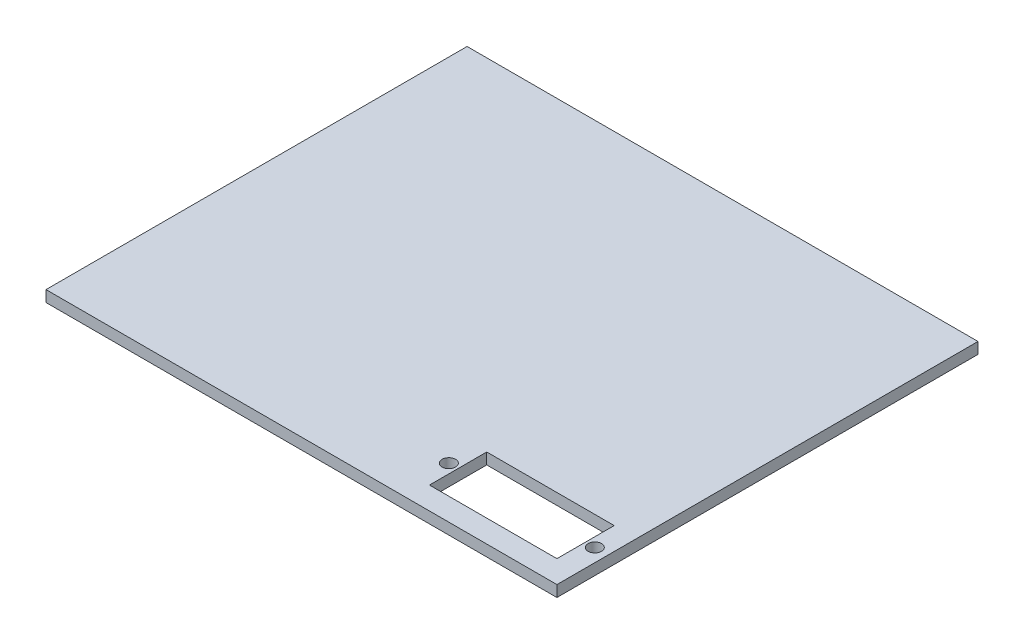
ISO-10303-21;
HEADER;
FILE_DESCRIPTION(('STEP AP214'),'2;1');
FILE_NAME('part.step','',(''),(''),'','','');
FILE_SCHEMA(('AUTOMOTIVE_DESIGN { 1 0 10303 214 1 1 1 1 }'));
ENDSEC;
DATA;
#1=APPLICATION_CONTEXT('core data for automotive mechanical design processes');
#2=APPLICATION_PROTOCOL_DEFINITION('international standard','automotive_design',2000,#1);
#3=PRODUCT_CONTEXT('',#1,'mechanical');
#4=PRODUCT('Part','Part','',(#3));
#5=PRODUCT_RELATED_PRODUCT_CATEGORY('part','',(#4));
#6=PRODUCT_DEFINITION_FORMATION('','',#4);
#7=PRODUCT_DEFINITION_CONTEXT('part definition',#1,'design');
#8=PRODUCT_DEFINITION('design','',#6,#7);
#9=PRODUCT_DEFINITION_SHAPE('','',#8);
#10=(LENGTH_UNIT() NAMED_UNIT(*) SI_UNIT(.MILLI.,.METRE.));
#11=(NAMED_UNIT(*) PLANE_ANGLE_UNIT() SI_UNIT($,.RADIAN.));
#12=(NAMED_UNIT(*) SI_UNIT($,.STERADIAN.) SOLID_ANGLE_UNIT());
#13=UNCERTAINTY_MEASURE_WITH_UNIT(LENGTH_MEASURE(1.E-05),#10,'distance_accuracy_value','');
#14=(GEOMETRIC_REPRESENTATION_CONTEXT(3) GLOBAL_UNCERTAINTY_ASSIGNED_CONTEXT((#13)) GLOBAL_UNIT_ASSIGNED_CONTEXT((#10,
#11,#12)) REPRESENTATION_CONTEXT('',''));
#15=CARTESIAN_POINT('',(0.,0.,0.));
#16=DIRECTION('',(0.,0.,1.));
#17=DIRECTION('',(1.,0.,0.));
#18=AXIS2_PLACEMENT_3D('',#15,#16,#17);
#19=CARTESIAN_POINT('',(45.5,2.,-37.5));
#20=DIRECTION('',(-1.,0.,0.));
#21=DIRECTION('',(0.,0.,1.));
#22=AXIS2_PLACEMENT_3D('',#19,#20,#21);
#23=PLANE('',#22);
#24=DIRECTION('',(0.,0.,-1.));
#25=VECTOR('',#24,1.);
#26=CARTESIAN_POINT('',(45.5,0.,-37.5));
#27=LINE('',#26,#25);
#28=CARTESIAN_POINT('',(45.5,0.,37.5));
#29=VERTEX_POINT('',#28);
#30=CARTESIAN_POINT('',(45.5,0.,-37.5));
#31=VERTEX_POINT('',#30);
#32=EDGE_CURVE('E140',#29,#31,#27,.T.);
#33=ORIENTED_EDGE('',*,*,#32,.T.);
#34=DIRECTION('',(0.,-1.,0.));
#35=VECTOR('',#34,1.);
#36=CARTESIAN_POINT('',(45.5,2.,-37.5));
#37=LINE('',#36,#35);
#38=CARTESIAN_POINT('',(45.5,2.,-37.5));
#39=VERTEX_POINT('',#38);
#40=EDGE_CURVE('E11',#39,#31,#37,.T.);
#41=ORIENTED_EDGE('',*,*,#40,.F.);
#42=DIRECTION('',(0.,0.,-1.));
#43=VECTOR('',#42,1.);
#44=CARTESIAN_POINT('',(45.5,2.,-37.5));
#45=LINE('',#44,#43);
#46=CARTESIAN_POINT('',(45.5,2.,37.5));
#47=VERTEX_POINT('',#46);
#48=EDGE_CURVE('E144',#47,#39,#45,.T.);
#49=ORIENTED_EDGE('',*,*,#48,.F.);
#50=DIRECTION('',(0.,-1.,0.));
#51=VECTOR('',#50,1.);
#52=CARTESIAN_POINT('',(45.5,2.,37.5));
#53=LINE('',#52,#51);
#54=EDGE_CURVE('E154',#47,#29,#53,.T.);
#55=ORIENTED_EDGE('',*,*,#54,.T.);
#56=EDGE_LOOP('',(#33,#41,#49,#55));
#57=FACE_BOUND('',#56,.T.);
#58=ADVANCED_FACE('F39',(#57),#23,.F.);
#59=CARTESIAN_POINT('',(-45.5,2.,-37.5));
#60=DIRECTION('',(0.,0.,1.));
#61=DIRECTION('',(1.,0.,0.));
#62=AXIS2_PLACEMENT_3D('',#59,#60,#61);
#63=PLANE('',#62);
#64=DIRECTION('',(-1.,0.,0.));
#65=VECTOR('',#64,1.);
#66=CARTESIAN_POINT('',(-45.5,0.,-37.5));
#67=LINE('',#66,#65);
#68=CARTESIAN_POINT('',(-45.5,0.,-37.5));
#69=VERTEX_POINT('',#68);
#70=EDGE_CURVE('E157',#31,#69,#67,.T.);
#71=ORIENTED_EDGE('',*,*,#70,.T.);
#72=DIRECTION('',(0.,-1.,0.));
#73=VECTOR('',#72,1.);
#74=CARTESIAN_POINT('',(-45.5,2.,-37.5));
#75=LINE('',#74,#73);
#76=CARTESIAN_POINT('',(-45.5,2.,-37.5));
#77=VERTEX_POINT('',#76);
#78=EDGE_CURVE('E46',#77,#69,#75,.T.);
#79=ORIENTED_EDGE('',*,*,#78,.F.);
#80=DIRECTION('',(-1.,0.,0.));
#81=VECTOR('',#80,1.);
#82=CARTESIAN_POINT('',(-45.5,2.,-37.5));
#83=LINE('',#82,#81);
#84=EDGE_CURVE('E147',#39,#77,#83,.T.);
#85=ORIENTED_EDGE('',*,*,#84,.F.);
#86=ORIENTED_EDGE('',*,*,#40,.T.);
#87=EDGE_LOOP('',(#71,#79,#85,#86));
#88=FACE_BOUND('',#87,.T.);
#89=ADVANCED_FACE('F185',(#88),#63,.F.);
#90=CARTESIAN_POINT('',(-45.5,2.,-37.5));
#91=DIRECTION('',(1.,0.,0.));
#92=DIRECTION('',(0.,0.,-1.));
#93=AXIS2_PLACEMENT_3D('',#90,#91,#92);
#94=PLANE('',#93);
#95=DIRECTION('',(0.,0.,1.));
#96=VECTOR('',#95,1.);
#97=CARTESIAN_POINT('',(-45.5,0.,-37.5));
#98=LINE('',#97,#96);
#99=CARTESIAN_POINT('',(-45.5,0.,37.5));
#100=VERTEX_POINT('',#99);
#101=EDGE_CURVE('E159',#69,#100,#98,.T.);
#102=ORIENTED_EDGE('',*,*,#101,.T.);
#103=DIRECTION('',(0.,-1.,0.));
#104=VECTOR('',#103,1.);
#105=CARTESIAN_POINT('',(-45.5,2.,37.5));
#106=LINE('',#105,#104);
#107=CARTESIAN_POINT('',(-45.5,2.,37.5));
#108=VERTEX_POINT('',#107);
#109=EDGE_CURVE('E164',#108,#100,#106,.T.);
#110=ORIENTED_EDGE('',*,*,#109,.F.);
#111=DIRECTION('',(0.,0.,1.));
#112=VECTOR('',#111,1.);
#113=CARTESIAN_POINT('',(-45.5,2.,-37.5));
#114=LINE('',#113,#112);
#115=EDGE_CURVE('E150',#77,#108,#114,.T.);
#116=ORIENTED_EDGE('',*,*,#115,.F.);
#117=ORIENTED_EDGE('',*,*,#78,.T.);
#118=EDGE_LOOP('',(#102,#110,#116,#117));
#119=FACE_BOUND('',#118,.T.);
#120=ADVANCED_FACE('F171',(#119),#94,.F.);
#121=CARTESIAN_POINT('',(-45.5,2.,37.5));
#122=DIRECTION('',(0.,0.,-1.));
#123=DIRECTION('',(-1.,0.,0.));
#124=AXIS2_PLACEMENT_3D('',#121,#122,#123);
#125=PLANE('',#124);
#126=DIRECTION('',(1.,0.,0.));
#127=VECTOR('',#126,1.);
#128=CARTESIAN_POINT('',(-45.5,0.,37.5));
#129=LINE('',#128,#127);
#130=EDGE_CURVE('E148',#100,#29,#129,.T.);
#131=ORIENTED_EDGE('',*,*,#130,.T.);
#132=ORIENTED_EDGE('',*,*,#54,.F.);
#133=DIRECTION('',(1.,0.,0.));
#134=VECTOR('',#133,1.);
#135=CARTESIAN_POINT('',(-45.5,2.,37.5));
#136=LINE('',#135,#134);
#137=EDGE_CURVE('E152',#108,#47,#136,.T.);
#138=ORIENTED_EDGE('',*,*,#137,.F.);
#139=ORIENTED_EDGE('',*,*,#109,.T.);
#140=EDGE_LOOP('',(#131,#132,#138,#139));
#141=FACE_BOUND('',#140,.T.);
#142=ADVANCED_FACE('F178',(#141),#125,.F.);
#143=CARTESIAN_POINT('',(0.,2.,0.));
#144=DIRECTION('',(0.,1.,0.));
#145=DIRECTION('',(0.,0.,1.));
#146=AXIS2_PLACEMENT_3D('',#143,#144,#145);
#147=PLANE('',#146);
#148=CARTESIAN_POINT('',(43.15,2.,28.4));
#149=DIRECTION('',(0.,1.,0.));
#150=DIRECTION('',(0.,0.,-1.));
#151=AXIS2_PLACEMENT_3D('',#148,#149,#150);
#152=CIRCLE('',#151,1.2);
#153=CARTESIAN_POINT('',(43.15,2.,27.2));
#154=VERTEX_POINT('',#153);
#155=EDGE_CURVE('E127',#154,#154,#152,.T.);
#156=ORIENTED_EDGE('',*,*,#155,.F.);
#157=EDGE_LOOP('',(#156));
#158=FACE_BOUND('',#157,.T.);
#159=CARTESIAN_POINT('',(17.15,2.,28.4));
#160=DIRECTION('',(0.,1.,0.));
#161=DIRECTION('',(0.,0.,1.));
#162=AXIS2_PLACEMENT_3D('',#159,#160,#161);
#163=CIRCLE('',#162,1.2);
#164=CARTESIAN_POINT('',(17.15,2.,29.6));
#165=VERTEX_POINT('',#164);
#166=EDGE_CURVE('E226',#165,#165,#163,.T.);
#167=ORIENTED_EDGE('',*,*,#166,.F.);
#168=EDGE_LOOP('',(#167));
#169=FACE_BOUND('',#168,.T.);
#170=DIRECTION('',(0.,0.,1.));
#171=VECTOR('',#170,1.);
#172=CARTESIAN_POINT('',(18.8,2.,23.3));
#173=LINE('',#172,#171);
#174=CARTESIAN_POINT('',(18.8,2.,23.3));
#175=VERTEX_POINT('',#174);
#176=CARTESIAN_POINT('',(18.8,2.,33.5));
#177=VERTEX_POINT('',#176);
#178=EDGE_CURVE('E53',#175,#177,#173,.T.);
#179=ORIENTED_EDGE('',*,*,#178,.F.);
#180=DIRECTION('',(-1.,0.,0.));
#181=VECTOR('',#180,1.);
#182=CARTESIAN_POINT('',(18.8,2.,23.3));
#183=LINE('',#182,#181);
#184=CARTESIAN_POINT('',(41.5,2.,23.3));
#185=VERTEX_POINT('',#184);
#186=EDGE_CURVE('E121',#185,#175,#183,.T.);
#187=ORIENTED_EDGE('',*,*,#186,.F.);
#188=DIRECTION('',(0.,0.,-1.));
#189=VECTOR('',#188,1.);
#190=CARTESIAN_POINT('',(41.5,2.,23.3));
#191=LINE('',#190,#189);
#192=CARTESIAN_POINT('',(41.5,2.,33.5));
#193=VERTEX_POINT('',#192);
#194=EDGE_CURVE('E124',#193,#185,#191,.T.);
#195=ORIENTED_EDGE('',*,*,#194,.F.);
#196=DIRECTION('',(1.,0.,0.));
#197=VECTOR('',#196,1.);
#198=CARTESIAN_POINT('',(18.8,2.,33.5));
#199=LINE('',#198,#197);
#200=EDGE_CURVE('E133',#177,#193,#199,.T.);
#201=ORIENTED_EDGE('',*,*,#200,.F.);
#202=EDGE_LOOP('',(#179,#187,#195,#201));
#203=FACE_BOUND('',#202,.T.);
#204=ORIENTED_EDGE('',*,*,#48,.T.);
#205=ORIENTED_EDGE('',*,*,#84,.T.);
#206=ORIENTED_EDGE('',*,*,#115,.T.);
#207=ORIENTED_EDGE('',*,*,#137,.T.);
#208=EDGE_LOOP('',(#204,#205,#206,#207));
#209=FACE_BOUND('',#208,.T.);
#210=ADVANCED_FACE('F184',(#158,#169,#203,#209),#147,.T.);
#211=CARTESIAN_POINT('',(0.,0.,0.));
#212=DIRECTION('',(0.,1.,0.));
#213=DIRECTION('',(0.,0.,1.));
#214=AXIS2_PLACEMENT_3D('',#211,#212,#213);
#215=PLANE('',#214);
#216=CARTESIAN_POINT('',(43.15,0.,28.4));
#217=DIRECTION('',(0.,1.,0.));
#218=DIRECTION('',(0.,0.,-1.));
#219=AXIS2_PLACEMENT_3D('',#216,#217,#218);
#220=CIRCLE('',#219,1.2);
#221=CARTESIAN_POINT('',(43.15,0.,27.2));
#222=VERTEX_POINT('',#221);
#223=EDGE_CURVE('E228',#222,#222,#220,.T.);
#224=ORIENTED_EDGE('',*,*,#223,.T.);
#225=EDGE_LOOP('',(#224));
#226=FACE_BOUND('',#225,.T.);
#227=CARTESIAN_POINT('',(17.15,0.,28.4));
#228=DIRECTION('',(0.,1.,0.));
#229=DIRECTION('',(0.,0.,1.));
#230=AXIS2_PLACEMENT_3D('',#227,#228,#229);
#231=CIRCLE('',#230,1.2);
#232=CARTESIAN_POINT('',(17.15,0.,29.6));
#233=VERTEX_POINT('',#232);
#234=EDGE_CURVE('E134',#233,#233,#231,.T.);
#235=ORIENTED_EDGE('',*,*,#234,.T.);
#236=EDGE_LOOP('',(#235));
#237=FACE_BOUND('',#236,.T.);
#238=DIRECTION('',(-1.,0.,0.));
#239=VECTOR('',#238,1.);
#240=CARTESIAN_POINT('',(18.8,0.,23.3));
#241=LINE('',#240,#239);
#242=CARTESIAN_POINT('',(41.5,0.,23.3));
#243=VERTEX_POINT('',#242);
#244=CARTESIAN_POINT('',(18.8,0.,23.3));
#245=VERTEX_POINT('',#244);
#246=EDGE_CURVE('E111',#243,#245,#241,.T.);
#247=ORIENTED_EDGE('',*,*,#246,.T.);
#248=DIRECTION('',(0.,0.,1.));
#249=VECTOR('',#248,1.);
#250=CARTESIAN_POINT('',(18.8,0.,23.3));
#251=LINE('',#250,#249);
#252=CARTESIAN_POINT('',(18.8,0.,33.5));
#253=VERTEX_POINT('',#252);
#254=EDGE_CURVE('E105',#245,#253,#251,.T.);
#255=ORIENTED_EDGE('',*,*,#254,.T.);
#256=DIRECTION('',(1.,0.,0.));
#257=VECTOR('',#256,1.);
#258=CARTESIAN_POINT('',(18.8,0.,33.5));
#259=LINE('',#258,#257);
#260=CARTESIAN_POINT('',(41.5,0.,33.5));
#261=VERTEX_POINT('',#260);
#262=EDGE_CURVE('E114',#253,#261,#259,.T.);
#263=ORIENTED_EDGE('',*,*,#262,.T.);
#264=DIRECTION('',(0.,0.,-1.));
#265=VECTOR('',#264,1.);
#266=CARTESIAN_POINT('',(41.5,0.,23.3));
#267=LINE('',#266,#265);
#268=EDGE_CURVE('E61',#261,#243,#267,.T.);
#269=ORIENTED_EDGE('',*,*,#268,.T.);
#270=EDGE_LOOP('',(#247,#255,#263,#269));
#271=FACE_BOUND('',#270,.T.);
#272=ORIENTED_EDGE('',*,*,#32,.F.);
#273=ORIENTED_EDGE('',*,*,#130,.F.);
#274=ORIENTED_EDGE('',*,*,#101,.F.);
#275=ORIENTED_EDGE('',*,*,#70,.F.);
#276=EDGE_LOOP('',(#272,#273,#274,#275));
#277=FACE_BOUND('',#276,.T.);
#278=ADVANCED_FACE('F118',(#226,#237,#271,#277),#215,.F.);
#279=CARTESIAN_POINT('',(18.8,0.,23.3));
#280=DIRECTION('',(-1.,0.,0.));
#281=DIRECTION('',(0.,0.,1.));
#282=AXIS2_PLACEMENT_3D('',#279,#280,#281);
#283=PLANE('',#282);
#284=ORIENTED_EDGE('',*,*,#178,.T.);
#285=DIRECTION('',(0.,1.,0.));
#286=VECTOR('',#285,1.);
#287=CARTESIAN_POINT('',(18.8,0.,33.5));
#288=LINE('',#287,#286);
#289=EDGE_CURVE('E101',#253,#177,#288,.T.);
#290=ORIENTED_EDGE('',*,*,#289,.F.);
#291=ORIENTED_EDGE('',*,*,#254,.F.);
#292=DIRECTION('',(0.,1.,0.));
#293=VECTOR('',#292,1.);
#294=CARTESIAN_POINT('',(18.8,0.,23.3));
#295=LINE('',#294,#293);
#296=EDGE_CURVE('E138',#245,#175,#295,.T.);
#297=ORIENTED_EDGE('',*,*,#296,.T.);
#298=EDGE_LOOP('',(#284,#290,#291,#297));
#299=FACE_BOUND('',#298,.T.);
#300=ADVANCED_FACE('F103',(#299),#283,.F.);
#301=CARTESIAN_POINT('',(18.8,0.,23.3));
#302=DIRECTION('',(0.,0.,-1.));
#303=DIRECTION('',(-1.,0.,0.));
#304=AXIS2_PLACEMENT_3D('',#301,#302,#303);
#305=PLANE('',#304);
#306=ORIENTED_EDGE('',*,*,#186,.T.);
#307=ORIENTED_EDGE('',*,*,#296,.F.);
#308=ORIENTED_EDGE('',*,*,#246,.F.);
#309=DIRECTION('',(0.,1.,0.));
#310=VECTOR('',#309,1.);
#311=CARTESIAN_POINT('',(41.5,0.,23.3));
#312=LINE('',#311,#310);
#313=EDGE_CURVE('E141',#243,#185,#312,.T.);
#314=ORIENTED_EDGE('',*,*,#313,.T.);
#315=EDGE_LOOP('',(#306,#307,#308,#314));
#316=FACE_BOUND('',#315,.T.);
#317=ADVANCED_FACE('F203',(#316),#305,.F.);
#318=CARTESIAN_POINT('',(41.5,0.,23.3));
#319=DIRECTION('',(1.,0.,0.));
#320=DIRECTION('',(0.,0.,-1.));
#321=AXIS2_PLACEMENT_3D('',#318,#319,#320);
#322=PLANE('',#321);
#323=ORIENTED_EDGE('',*,*,#194,.T.);
#324=ORIENTED_EDGE('',*,*,#313,.F.);
#325=ORIENTED_EDGE('',*,*,#268,.F.);
#326=DIRECTION('',(0.,1.,0.));
#327=VECTOR('',#326,1.);
#328=CARTESIAN_POINT('',(41.5,0.,33.5));
#329=LINE('',#328,#327);
#330=EDGE_CURVE('E110',#261,#193,#329,.T.);
#331=ORIENTED_EDGE('',*,*,#330,.T.);
#332=EDGE_LOOP('',(#323,#324,#325,#331));
#333=FACE_BOUND('',#332,.T.);
#334=ADVANCED_FACE('F207',(#333),#322,.F.);
#335=CARTESIAN_POINT('',(18.8,0.,33.5));
#336=DIRECTION('',(0.,0.,1.));
#337=DIRECTION('',(1.,0.,0.));
#338=AXIS2_PLACEMENT_3D('',#335,#336,#337);
#339=PLANE('',#338);
#340=ORIENTED_EDGE('',*,*,#200,.T.);
#341=ORIENTED_EDGE('',*,*,#330,.F.);
#342=ORIENTED_EDGE('',*,*,#262,.F.);
#343=ORIENTED_EDGE('',*,*,#289,.T.);
#344=EDGE_LOOP('',(#340,#341,#342,#343));
#345=FACE_BOUND('',#344,.T.);
#346=ADVANCED_FACE('F115',(#345),#339,.F.);
#347=CARTESIAN_POINT('',(17.15,0.,28.4));
#348=DIRECTION('',(0.,1.,0.));
#349=DIRECTION('',(0.,0.,1.));
#350=AXIS2_PLACEMENT_3D('',#347,#348,#349);
#351=CYLINDRICAL_SURFACE('',#350,1.2);
#352=ORIENTED_EDGE('',*,*,#234,.F.);
#353=EDGE_LOOP('',(#352));
#354=FACE_BOUND('',#353,.T.);
#355=ORIENTED_EDGE('',*,*,#166,.T.);
#356=EDGE_LOOP('',(#355));
#357=FACE_BOUND('',#356,.T.);
#358=ADVANCED_FACE('F206',(#354,#357),#351,.F.);
#359=CARTESIAN_POINT('',(43.15,0.,28.4));
#360=DIRECTION('',(0.,1.,0.));
#361=DIRECTION('',(0.,0.,1.));
#362=AXIS2_PLACEMENT_3D('',#359,#360,#361);
#363=CYLINDRICAL_SURFACE('',#362,1.2);
#364=ORIENTED_EDGE('',*,*,#223,.F.);
#365=EDGE_LOOP('',(#364));
#366=FACE_BOUND('',#365,.T.);
#367=ORIENTED_EDGE('',*,*,#155,.T.);
#368=EDGE_LOOP('',(#367));
#369=FACE_BOUND('',#368,.T.);
#370=ADVANCED_FACE('F213',(#366,#369),#363,.F.);
#371=CLOSED_SHELL('',(#58,#89,#120,#142,#210,#278,#300,#317,#334,#346,#358,#370));
#372=MANIFOLD_SOLID_BREP('B2',#371);
#373=ADVANCED_BREP_SHAPE_REPRESENTATION('',(#18,#372),#14);
#374=SHAPE_DEFINITION_REPRESENTATION(#9,#373);
ENDSEC;
END-ISO-10303-21;
